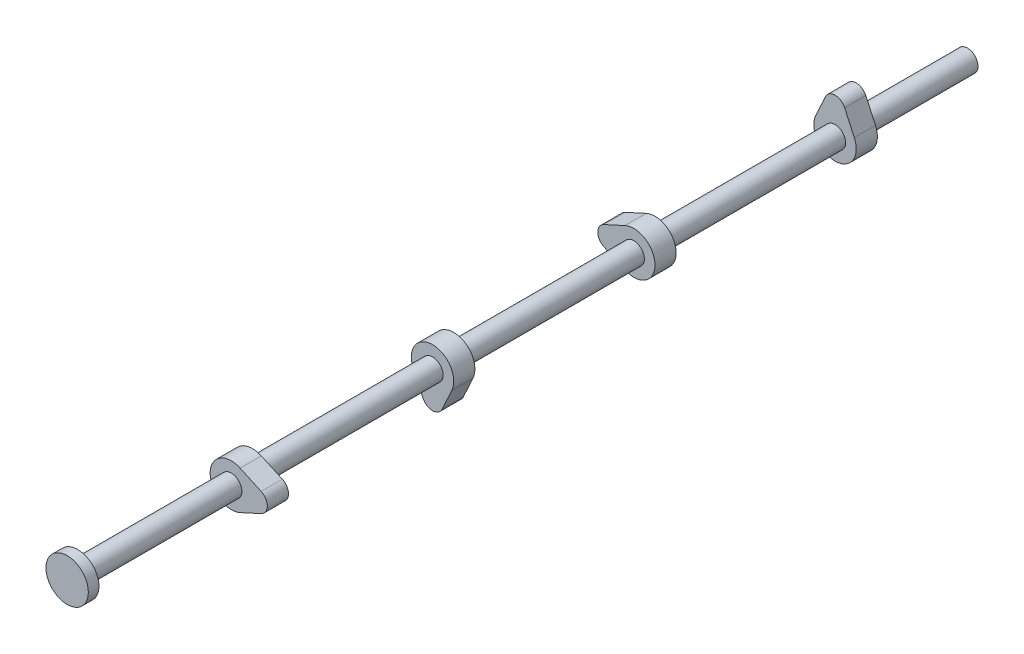
ISO-10303-21;
HEADER;
FILE_DESCRIPTION(('STEP AP214'),'2;1');
FILE_NAME('part.step','',(''),(''),'','','');
FILE_SCHEMA(('AUTOMOTIVE_DESIGN { 1 0 10303 214 1 1 1 1 }'));
ENDSEC;
DATA;
#1=APPLICATION_CONTEXT('core data for automotive mechanical design processes');
#2=APPLICATION_PROTOCOL_DEFINITION('international standard','automotive_design',2000,#1);
#3=PRODUCT_CONTEXT('',#1,'mechanical');
#4=PRODUCT('Part','Part','',(#3));
#5=PRODUCT_RELATED_PRODUCT_CATEGORY('part','',(#4));
#6=PRODUCT_DEFINITION_FORMATION('','',#4);
#7=PRODUCT_DEFINITION_CONTEXT('part definition',#1,'design');
#8=PRODUCT_DEFINITION('design','',#6,#7);
#9=PRODUCT_DEFINITION_SHAPE('','',#8);
#10=(LENGTH_UNIT() NAMED_UNIT(*) SI_UNIT(.MILLI.,.METRE.));
#11=(NAMED_UNIT(*) PLANE_ANGLE_UNIT() SI_UNIT($,.RADIAN.));
#12=(NAMED_UNIT(*) SI_UNIT($,.STERADIAN.) SOLID_ANGLE_UNIT());
#13=UNCERTAINTY_MEASURE_WITH_UNIT(LENGTH_MEASURE(1.E-05),#10,'distance_accuracy_value','');
#14=(GEOMETRIC_REPRESENTATION_CONTEXT(3) GLOBAL_UNCERTAINTY_ASSIGNED_CONTEXT((#13)) GLOBAL_UNIT_ASSIGNED_CONTEXT((#10,
#11,#12)) REPRESENTATION_CONTEXT('',''));
#15=CARTESIAN_POINT('',(0.,0.,0.));
#16=DIRECTION('',(0.,0.,1.));
#17=DIRECTION('',(1.,0.,0.));
#18=AXIS2_PLACEMENT_3D('',#15,#16,#17);
#19=CARTESIAN_POINT('',(0.,0.,2413.));
#20=DIRECTION('',(0.,0.,-1.));
#21=DIRECTION('',(0.,-1.,0.));
#22=AXIS2_PLACEMENT_3D('',#19,#20,#21);
#23=CYLINDRICAL_SURFACE('',#22,127.);
#24=CARTESIAN_POINT('',(0.,0.,1333.5));
#25=DIRECTION('',(0.,0.,1.));
#26=DIRECTION('',(0.,1.,0.));
#27=AXIS2_PLACEMENT_3D('',#24,#25,#26);
#28=CIRCLE('',#27,127.);
#29=CARTESIAN_POINT('',(1.33025439009923E-12,127.,1333.5));
#30=VERTEX_POINT('',#29);
#31=EDGE_CURVE('E55',#30,#30,#28,.T.);
#32=ORIENTED_EDGE('',*,*,#31,.T.);
#33=EDGE_LOOP('',(#32));
#34=FACE_BOUND('',#33,.T.);
#35=CARTESIAN_POINT('',(0.,0.,3492.5));
#36=DIRECTION('',(0.,0.,1.));
#37=DIRECTION('',(-1.,0.,0.));
#38=AXIS2_PLACEMENT_3D('',#35,#36,#37);
#39=CIRCLE('',#38,127.);
#40=CARTESIAN_POINT('',(-127.,8.86836260066156E-13,3492.5));
#41=VERTEX_POINT('',#40);
#42=EDGE_CURVE('E206',#41,#41,#39,.T.);
#43=ORIENTED_EDGE('',*,*,#42,.F.);
#44=EDGE_LOOP('',(#43));
#45=FACE_BOUND('',#44,.T.);
#46=ADVANCED_FACE('F47',(#34,#45),#23,.T.);
#47=CARTESIAN_POINT('',(0.,0.,1333.5));
#48=DIRECTION('',(0.,0.,-1.));
#49=DIRECTION('',(0.,-1.,0.));
#50=AXIS2_PLACEMENT_3D('',#47,#48,#49);
#51=CYLINDRICAL_SURFACE('',#50,254.);
#52=CARTESIAN_POINT('',(0.,0.,1079.5));
#53=DIRECTION('',(0.,0.,1.));
#54=DIRECTION('',(0.,1.,0.));
#55=AXIS2_PLACEMENT_3D('',#52,#53,#54);
#56=CIRCLE('',#55,254.);
#57=CARTESIAN_POINT('',(-230.901073093122,105.833333333336,1079.5));
#58=VERTEX_POINT('',#57);
#59=CARTESIAN_POINT('',(230.901073093124,105.833333333331,1079.5));
#60=VERTEX_POINT('',#59);
#61=EDGE_CURVE('E315',#58,#60,#56,.T.);
#62=ORIENTED_EDGE('',*,*,#61,.T.);
#63=DIRECTION('',(0.,0.,-1.));
#64=VECTOR('',#63,1.);
#65=CARTESIAN_POINT('',(230.901073093124,105.833333333331,1333.5));
#66=LINE('',#65,#64);
#67=CARTESIAN_POINT('',(230.901073093124,105.833333333331,1333.5));
#68=VERTEX_POINT('',#67);
#69=EDGE_CURVE('E343',#68,#60,#66,.T.);
#70=ORIENTED_EDGE('',*,*,#69,.F.);
#71=CARTESIAN_POINT('',(0.,0.,1333.5));
#72=DIRECTION('',(0.,0.,1.));
#73=DIRECTION('',(0.,1.,0.));
#74=AXIS2_PLACEMENT_3D('',#71,#72,#73);
#75=CIRCLE('',#74,254.);
#76=CARTESIAN_POINT('',(-230.901073093122,105.833333333336,1333.5));
#77=VERTEX_POINT('',#76);
#78=EDGE_CURVE('E316',#77,#68,#75,.T.);
#79=ORIENTED_EDGE('',*,*,#78,.F.);
#80=DIRECTION('',(0.,0.,-1.));
#81=VECTOR('',#80,1.);
#82=CARTESIAN_POINT('',(-230.901073093122,105.833333333336,1333.5));
#83=LINE('',#82,#81);
#84=EDGE_CURVE('E326',#77,#58,#83,.T.);
#85=ORIENTED_EDGE('',*,*,#84,.T.);
#86=EDGE_LOOP('',(#62,#70,#79,#85));
#87=FACE_BOUND('',#86,.T.);
#88=ADVANCED_FACE('F363',(#87),#51,.T.);
#89=CARTESIAN_POINT('',(230.901073093124,105.833333333331,1333.5));
#90=DIRECTION('',(-0.909059342886314,-0.416666666666657,0.));
#91=DIRECTION('',(0.416666666666657,-0.909059342886314,0.));
#92=AXIS2_PLACEMENT_3D('',#89,#90,#91);
#93=PLANE('',#92);
#94=DIRECTION('',(-0.416666666666657,0.909059342886314,0.));
#95=VECTOR('',#94,1.);
#96=CARTESIAN_POINT('',(230.901073093124,105.833333333331,1079.5));
#97=LINE('',#96,#95);
#98=CARTESIAN_POINT('',(115.450536546565,357.716666666665,1079.5));
#99=VERTEX_POINT('',#98);
#100=EDGE_CURVE('E329',#60,#99,#97,.T.);
#101=ORIENTED_EDGE('',*,*,#100,.T.);
#102=DIRECTION('',(0.,0.,-1.));
#103=VECTOR('',#102,1.);
#104=CARTESIAN_POINT('',(115.450536546565,357.716666666665,1333.5));
#105=LINE('',#104,#103);
#106=CARTESIAN_POINT('',(115.450536546565,357.716666666665,1333.5));
#107=VERTEX_POINT('',#106);
#108=EDGE_CURVE('E344',#107,#99,#105,.T.);
#109=ORIENTED_EDGE('',*,*,#108,.F.);
#110=DIRECTION('',(-0.416666666666657,0.909059342886314,0.));
#111=VECTOR('',#110,1.);
#112=CARTESIAN_POINT('',(230.901073093124,105.833333333331,1333.5));
#113=LINE('',#112,#111);
#114=EDGE_CURVE('E98',#68,#107,#113,.T.);
#115=ORIENTED_EDGE('',*,*,#114,.F.);
#116=ORIENTED_EDGE('',*,*,#69,.T.);
#117=EDGE_LOOP('',(#101,#109,#115,#116));
#118=FACE_BOUND('',#117,.T.);
#119=ADVANCED_FACE('F365',(#118),#93,.F.);
#120=CARTESIAN_POINT('',(3.15444661976667E-12,304.8,1333.5));
#121=DIRECTION('',(0.,0.,-1.));
#122=DIRECTION('',(0.,-1.,0.));
#123=AXIS2_PLACEMENT_3D('',#120,#121,#122);
#124=CYLINDRICAL_SURFACE('',#123,127.);
#125=CARTESIAN_POINT('',(3.15444661976667E-12,304.8,1079.5));
#126=DIRECTION('',(0.,0.,1.));
#127=DIRECTION('',(0.,1.,0.));
#128=AXIS2_PLACEMENT_3D('',#125,#126,#127);
#129=CIRCLE('',#128,127.);
#130=CARTESIAN_POINT('',(-115.450536546558,357.716666666668,1079.5));
#131=VERTEX_POINT('',#130);
#132=EDGE_CURVE('E81',#99,#131,#129,.T.);
#133=ORIENTED_EDGE('',*,*,#132,.T.);
#134=DIRECTION('',(0.,0.,-1.));
#135=VECTOR('',#134,1.);
#136=CARTESIAN_POINT('',(-115.450536546558,357.716666666668,1333.5));
#137=LINE('',#136,#135);
#138=CARTESIAN_POINT('',(-115.450536546558,357.716666666668,1333.5));
#139=VERTEX_POINT('',#138);
#140=EDGE_CURVE('E338',#139,#131,#137,.T.);
#141=ORIENTED_EDGE('',*,*,#140,.F.);
#142=CARTESIAN_POINT('',(3.15444661976667E-12,304.8,1333.5));
#143=DIRECTION('',(0.,0.,1.));
#144=DIRECTION('',(0.,1.,0.));
#145=AXIS2_PLACEMENT_3D('',#142,#143,#144);
#146=CIRCLE('',#145,127.);
#147=EDGE_CURVE('E321',#107,#139,#146,.T.);
#148=ORIENTED_EDGE('',*,*,#147,.F.);
#149=ORIENTED_EDGE('',*,*,#108,.T.);
#150=EDGE_LOOP('',(#133,#141,#148,#149));
#151=FACE_BOUND('',#150,.T.);
#152=ADVANCED_FACE('F368',(#151),#124,.T.);
#153=CARTESIAN_POINT('',(-230.901073093122,105.833333333336,1333.5));
#154=DIRECTION('',(0.909059342886305,-0.416666666666676,0.));
#155=DIRECTION('',(0.416666666666676,0.909059342886305,0.));
#156=AXIS2_PLACEMENT_3D('',#153,#154,#155);
#157=PLANE('',#156);
#158=DIRECTION('',(-0.416666666666676,-0.909059342886305,0.));
#159=VECTOR('',#158,1.);
#160=CARTESIAN_POINT('',(-230.901073093122,105.833333333336,1079.5));
#161=LINE('',#160,#159);
#162=EDGE_CURVE('E89',#131,#58,#161,.T.);
#163=ORIENTED_EDGE('',*,*,#162,.T.);
#164=ORIENTED_EDGE('',*,*,#84,.F.);
#165=DIRECTION('',(-0.416666666666676,-0.909059342886305,0.));
#166=VECTOR('',#165,1.);
#167=CARTESIAN_POINT('',(-230.901073093122,105.833333333336,1333.5));
#168=LINE('',#167,#166);
#169=EDGE_CURVE('E67',#139,#77,#168,.T.);
#170=ORIENTED_EDGE('',*,*,#169,.F.);
#171=ORIENTED_EDGE('',*,*,#140,.T.);
#172=EDGE_LOOP('',(#163,#164,#170,#171));
#173=FACE_BOUND('',#172,.T.);
#174=ADVANCED_FACE('F359',(#173),#157,.F.);
#175=CARTESIAN_POINT('',(0.,0.,1333.5));
#176=DIRECTION('',(0.,0.,1.));
#177=DIRECTION('',(0.,1.,0.));
#178=AXIS2_PLACEMENT_3D('',#175,#176,#177);
#179=PLANE('',#178);
#180=ORIENTED_EDGE('',*,*,#31,.F.);
#181=EDGE_LOOP('',(#180));
#182=FACE_BOUND('',#181,.T.);
#183=ORIENTED_EDGE('',*,*,#78,.T.);
#184=ORIENTED_EDGE('',*,*,#114,.T.);
#185=ORIENTED_EDGE('',*,*,#147,.T.);
#186=ORIENTED_EDGE('',*,*,#169,.T.);
#187=EDGE_LOOP('',(#183,#184,#185,#186));
#188=FACE_BOUND('',#187,.T.);
#189=ADVANCED_FACE('F353',(#182,#188),#179,.T.);
#190=CARTESIAN_POINT('',(0.,0.,1079.5));
#191=DIRECTION('',(0.,0.,1.));
#192=DIRECTION('',(0.,1.,0.));
#193=AXIS2_PLACEMENT_3D('',#190,#191,#192);
#194=PLANE('',#193);
#195=CARTESIAN_POINT('',(0.,0.,1079.5));
#196=DIRECTION('',(0.,0.,1.));
#197=DIRECTION('',(0.,1.,0.));
#198=AXIS2_PLACEMENT_3D('',#195,#196,#197);
#199=CIRCLE('',#198,127.);
#200=CARTESIAN_POINT('',(1.33025439009923E-12,127.,1079.5));
#201=VERTEX_POINT('',#200);
#202=EDGE_CURVE('E11',#201,#201,#199,.T.);
#203=ORIENTED_EDGE('',*,*,#202,.T.);
#204=EDGE_LOOP('',(#203));
#205=FACE_BOUND('',#204,.T.);
#206=ORIENTED_EDGE('',*,*,#61,.F.);
#207=ORIENTED_EDGE('',*,*,#162,.F.);
#208=ORIENTED_EDGE('',*,*,#132,.F.);
#209=ORIENTED_EDGE('',*,*,#100,.F.);
#210=EDGE_LOOP('',(#206,#207,#208,#209));
#211=FACE_BOUND('',#210,.T.);
#212=ADVANCED_FACE('F357',(#205,#211),#194,.F.);
#213=ORIENTED_EDGE('',*,*,#202,.F.);
#214=EDGE_LOOP('',(#213));
#215=FACE_BOUND('',#214,.T.);
#216=CARTESIAN_POINT('',(0.,0.,-254.));
#217=DIRECTION('',(0.,0.,-1.));
#218=DIRECTION('',(-1.,0.,0.));
#219=AXIS2_PLACEMENT_3D('',#216,#217,#218);
#220=CIRCLE('',#219,127.);
#221=CARTESIAN_POINT('',(-127.,0.,-254.));
#222=VERTEX_POINT('',#221);
#223=EDGE_CURVE('E396',#222,#222,#220,.T.);
#224=ORIENTED_EDGE('',*,*,#223,.F.);
#225=EDGE_LOOP('',(#224));
#226=FACE_BOUND('',#225,.T.);
#227=ADVANCED_FACE('F378',(#215,#226),#23,.T.);
#228=CARTESIAN_POINT('',(0.,0.,9652.));
#229=DIRECTION('',(0.,0.,-1.));
#230=DIRECTION('',(-1.,0.,0.));
#231=AXIS2_PLACEMENT_3D('',#228,#229,#230);
#232=CYLINDRICAL_SURFACE('',#231,127.);
#233=CARTESIAN_POINT('',(0.,0.,8572.5));
#234=DIRECTION('',(0.,0.,1.));
#235=DIRECTION('',(1.,0.,0.));
#236=AXIS2_PLACEMENT_3D('',#233,#234,#235);
#237=CIRCLE('',#236,127.);
#238=CARTESIAN_POINT('',(127.,0.,8572.5));
#239=VERTEX_POINT('',#238);
#240=EDGE_CURVE('E307',#239,#239,#237,.T.);
#241=ORIENTED_EDGE('',*,*,#240,.T.);
#242=EDGE_LOOP('',(#241));
#243=FACE_BOUND('',#242,.T.);
#244=CARTESIAN_POINT('',(0.,0.,10414.));
#245=DIRECTION('',(0.,0.,1.));
#246=DIRECTION('',(1.,0.,0.));
#247=AXIS2_PLACEMENT_3D('',#244,#245,#246);
#248=CIRCLE('',#247,127.);
#249=CARTESIAN_POINT('',(127.,0.,10414.));
#250=VERTEX_POINT('',#249);
#251=EDGE_CURVE('E405',#250,#250,#248,.T.);
#252=ORIENTED_EDGE('',*,*,#251,.F.);
#253=EDGE_LOOP('',(#252));
#254=FACE_BOUND('',#253,.T.);
#255=ADVANCED_FACE('F382',(#243,#254),#232,.T.);
#256=CARTESIAN_POINT('',(0.,0.,8572.5));
#257=DIRECTION('',(0.,0.,-1.));
#258=DIRECTION('',(-1.,0.,0.));
#259=AXIS2_PLACEMENT_3D('',#256,#257,#258);
#260=CYLINDRICAL_SURFACE('',#259,254.);
#261=CARTESIAN_POINT('',(0.,0.,8318.5));
#262=DIRECTION('',(0.,0.,1.));
#263=DIRECTION('',(1.,0.,0.));
#264=AXIS2_PLACEMENT_3D('',#261,#262,#263);
#265=CIRCLE('',#264,254.);
#266=CARTESIAN_POINT('',(105.833333333333,230.901073093123,8318.5));
#267=VERTEX_POINT('',#266);
#268=CARTESIAN_POINT('',(105.833333333333,-230.901073093123,8318.5));
#269=VERTEX_POINT('',#268);
#270=EDGE_CURVE('E265',#267,#269,#265,.T.);
#271=ORIENTED_EDGE('',*,*,#270,.T.);
#272=DIRECTION('',(0.,0.,-1.));
#273=VECTOR('',#272,1.);
#274=CARTESIAN_POINT('',(105.833333333333,-230.901073093123,8572.5));
#275=LINE('',#274,#273);
#276=CARTESIAN_POINT('',(105.833333333333,-230.901073093123,8572.5));
#277=VERTEX_POINT('',#276);
#278=EDGE_CURVE('E305',#277,#269,#275,.T.);
#279=ORIENTED_EDGE('',*,*,#278,.F.);
#280=CARTESIAN_POINT('',(0.,0.,8572.5));
#281=DIRECTION('',(0.,0.,1.));
#282=DIRECTION('',(1.,0.,0.));
#283=AXIS2_PLACEMENT_3D('',#280,#281,#282);
#284=CIRCLE('',#283,254.);
#285=CARTESIAN_POINT('',(105.833333333333,230.901073093123,8572.5));
#286=VERTEX_POINT('',#285);
#287=EDGE_CURVE('E266',#286,#277,#284,.T.);
#288=ORIENTED_EDGE('',*,*,#287,.F.);
#289=DIRECTION('',(0.,0.,-1.));
#290=VECTOR('',#289,1.);
#291=CARTESIAN_POINT('',(105.833333333333,230.901073093123,8572.5));
#292=LINE('',#291,#290);
#293=EDGE_CURVE('E278',#286,#267,#292,.T.);
#294=ORIENTED_EDGE('',*,*,#293,.T.);
#295=EDGE_LOOP('',(#271,#279,#288,#294));
#296=FACE_BOUND('',#295,.T.);
#297=ADVANCED_FACE('F388',(#296),#260,.T.);
#298=CARTESIAN_POINT('',(105.833333333333,-230.901073093123,8572.5));
#299=DIRECTION('',(-0.416666666666667,0.909059342886309,0.));
#300=DIRECTION('',(-0.90905934288631,-0.416666666666667,0.));
#301=AXIS2_PLACEMENT_3D('',#298,#299,#300);
#302=PLANE('',#301);
#303=DIRECTION('',(0.909059342886309,0.416666666666667,0.));
#304=VECTOR('',#303,1.);
#305=CARTESIAN_POINT('',(105.833333333333,-230.901073093123,8318.5));
#306=LINE('',#305,#304);
#307=CARTESIAN_POINT('',(357.716666666667,-115.450536546561,8318.5));
#308=VERTEX_POINT('',#307);
#309=EDGE_CURVE('E283',#269,#308,#306,.T.);
#310=ORIENTED_EDGE('',*,*,#309,.T.);
#311=DIRECTION('',(0.,0.,-1.));
#312=VECTOR('',#311,1.);
#313=CARTESIAN_POINT('',(357.716666666667,-115.450536546561,8572.5));
#314=LINE('',#313,#312);
#315=CARTESIAN_POINT('',(357.716666666667,-115.450536546561,8572.5));
#316=VERTEX_POINT('',#315);
#317=EDGE_CURVE('E298',#316,#308,#314,.T.);
#318=ORIENTED_EDGE('',*,*,#317,.F.);
#319=DIRECTION('',(0.909059342886309,0.416666666666667,0.));
#320=VECTOR('',#319,1.);
#321=CARTESIAN_POINT('',(105.833333333333,-230.901073093123,8572.5));
#322=LINE('',#321,#320);
#323=EDGE_CURVE('E269',#277,#316,#322,.T.);
#324=ORIENTED_EDGE('',*,*,#323,.F.);
#325=ORIENTED_EDGE('',*,*,#278,.T.);
#326=EDGE_LOOP('',(#310,#318,#324,#325));
#327=FACE_BOUND('',#326,.T.);
#328=ADVANCED_FACE('F491',(#327),#302,.F.);
#329=CARTESIAN_POINT('',(304.8,0.,8572.5));
#330=DIRECTION('',(0.,0.,-1.));
#331=DIRECTION('',(-1.,0.,0.));
#332=AXIS2_PLACEMENT_3D('',#329,#330,#331);
#333=CYLINDRICAL_SURFACE('',#332,127.);
#334=CARTESIAN_POINT('',(304.8,0.,8318.5));
#335=DIRECTION('',(0.,0.,1.));
#336=DIRECTION('',(1.,0.,0.));
#337=AXIS2_PLACEMENT_3D('',#334,#335,#336);
#338=CIRCLE('',#337,127.);
#339=CARTESIAN_POINT('',(357.716666666667,115.450536546561,8318.5));
#340=VERTEX_POINT('',#339);
#341=EDGE_CURVE('E289',#308,#340,#338,.T.);
#342=ORIENTED_EDGE('',*,*,#341,.T.);
#343=DIRECTION('',(0.,0.,-1.));
#344=VECTOR('',#343,1.);
#345=CARTESIAN_POINT('',(357.716666666667,115.450536546561,8572.5));
#346=LINE('',#345,#344);
#347=CARTESIAN_POINT('',(357.716666666667,115.450536546561,8572.5));
#348=VERTEX_POINT('',#347);
#349=EDGE_CURVE('E293',#348,#340,#346,.T.);
#350=ORIENTED_EDGE('',*,*,#349,.F.);
#351=CARTESIAN_POINT('',(304.8,0.,8572.5));
#352=DIRECTION('',(0.,0.,1.));
#353=DIRECTION('',(1.,0.,0.));
#354=AXIS2_PLACEMENT_3D('',#351,#352,#353);
#355=CIRCLE('',#354,127.);
#356=EDGE_CURVE('E273',#316,#348,#355,.T.);
#357=ORIENTED_EDGE('',*,*,#356,.F.);
#358=ORIENTED_EDGE('',*,*,#317,.T.);
#359=EDGE_LOOP('',(#342,#350,#357,#358));
#360=FACE_BOUND('',#359,.T.);
#361=ADVANCED_FACE('F490',(#360),#333,.T.);
#362=CARTESIAN_POINT('',(105.833333333333,230.901073093123,8572.5));
#363=DIRECTION('',(-0.416666666666667,-0.90905934288631,0.));
#364=DIRECTION('',(0.90905934288631,-0.416666666666667,0.));
#365=AXIS2_PLACEMENT_3D('',#362,#363,#364);
#366=PLANE('',#365);
#367=DIRECTION('',(-0.909059342886309,0.416666666666667,0.));
#368=VECTOR('',#367,1.);
#369=CARTESIAN_POINT('',(105.833333333333,230.901073093123,8318.5));
#370=LINE('',#369,#368);
#371=EDGE_CURVE('E271',#340,#267,#370,.T.);
#372=ORIENTED_EDGE('',*,*,#371,.T.);
#373=ORIENTED_EDGE('',*,*,#293,.F.);
#374=DIRECTION('',(-0.909059342886309,0.416666666666667,0.));
#375=VECTOR('',#374,1.);
#376=CARTESIAN_POINT('',(105.833333333333,230.901073093123,8572.5));
#377=LINE('',#376,#375);
#378=EDGE_CURVE('E280',#348,#286,#377,.T.);
#379=ORIENTED_EDGE('',*,*,#378,.F.);
#380=ORIENTED_EDGE('',*,*,#349,.T.);
#381=EDGE_LOOP('',(#372,#373,#379,#380));
#382=FACE_BOUND('',#381,.T.);
#383=ADVANCED_FACE('F477',(#382),#366,.F.);
#384=CARTESIAN_POINT('',(0.,0.,8572.5));
#385=DIRECTION('',(0.,0.,1.));
#386=DIRECTION('',(1.,0.,0.));
#387=AXIS2_PLACEMENT_3D('',#384,#385,#386);
#388=PLANE('',#387);
#389=ORIENTED_EDGE('',*,*,#240,.F.);
#390=EDGE_LOOP('',(#389));
#391=FACE_BOUND('',#390,.T.);
#392=ORIENTED_EDGE('',*,*,#287,.T.);
#393=ORIENTED_EDGE('',*,*,#323,.T.);
#394=ORIENTED_EDGE('',*,*,#356,.T.);
#395=ORIENTED_EDGE('',*,*,#378,.T.);
#396=EDGE_LOOP('',(#392,#393,#394,#395));
#397=FACE_BOUND('',#396,.T.);
#398=ADVANCED_FACE('F478',(#391,#397),#388,.T.);
#399=CARTESIAN_POINT('',(0.,0.,8318.5));
#400=DIRECTION('',(0.,0.,1.));
#401=DIRECTION('',(1.,0.,0.));
#402=AXIS2_PLACEMENT_3D('',#399,#400,#401);
#403=PLANE('',#402);
#404=CARTESIAN_POINT('',(0.,0.,8318.5));
#405=DIRECTION('',(0.,0.,1.));
#406=DIRECTION('',(1.,0.,0.));
#407=AXIS2_PLACEMENT_3D('',#404,#405,#406);
#408=CIRCLE('',#407,127.);
#409=CARTESIAN_POINT('',(127.,0.,8318.5));
#410=VERTEX_POINT('',#409);
#411=EDGE_CURVE('E306',#410,#410,#408,.T.);
#412=ORIENTED_EDGE('',*,*,#411,.T.);
#413=EDGE_LOOP('',(#412));
#414=FACE_BOUND('',#413,.T.);
#415=ORIENTED_EDGE('',*,*,#270,.F.);
#416=ORIENTED_EDGE('',*,*,#371,.F.);
#417=ORIENTED_EDGE('',*,*,#341,.F.);
#418=ORIENTED_EDGE('',*,*,#309,.F.);
#419=EDGE_LOOP('',(#415,#416,#417,#418));
#420=FACE_BOUND('',#419,.T.);
#421=ADVANCED_FACE('F479',(#414,#420),#403,.F.);
#422=ORIENTED_EDGE('',*,*,#411,.F.);
#423=EDGE_LOOP('',(#422));
#424=FACE_BOUND('',#423,.T.);
#425=CARTESIAN_POINT('',(0.,0.,6159.5));
#426=DIRECTION('',(0.,0.,1.));
#427=DIRECTION('',(0.,-1.,0.));
#428=AXIS2_PLACEMENT_3D('',#425,#426,#427);
#429=CIRCLE('',#428,127.);
#430=CARTESIAN_POINT('',(-4.43418130033078E-13,-127.,6159.5));
#431=VERTEX_POINT('',#430);
#432=EDGE_CURVE('E260',#431,#431,#429,.T.);
#433=ORIENTED_EDGE('',*,*,#432,.T.);
#434=EDGE_LOOP('',(#433));
#435=FACE_BOUND('',#434,.T.);
#436=ADVANCED_FACE('F392',(#424,#435),#232,.T.);
#437=CARTESIAN_POINT('',(0.,0.,6159.5));
#438=DIRECTION('',(0.,0.,-1.));
#439=DIRECTION('',(0.,1.,0.));
#440=AXIS2_PLACEMENT_3D('',#437,#438,#439);
#441=CYLINDRICAL_SURFACE('',#440,254.);
#442=CARTESIAN_POINT('',(0.,0.,5905.5));
#443=DIRECTION('',(0.,0.,1.));
#444=DIRECTION('',(0.,-1.,0.));
#445=AXIS2_PLACEMENT_3D('',#442,#443,#444);
#446=CIRCLE('',#445,254.);
#447=CARTESIAN_POINT('',(230.901073093122,-105.833333333334,5905.5));
#448=VERTEX_POINT('',#447);
#449=CARTESIAN_POINT('',(-230.901073093123,-105.833333333333,5905.5));
#450=VERTEX_POINT('',#449);
#451=EDGE_CURVE('E212',#448,#450,#446,.T.);
#452=ORIENTED_EDGE('',*,*,#451,.T.);
#453=DIRECTION('',(0.,0.,-1.));
#454=VECTOR('',#453,1.);
#455=CARTESIAN_POINT('',(-230.901073093123,-105.833333333333,6159.5));
#456=LINE('',#455,#454);
#457=CARTESIAN_POINT('',(-230.901073093123,-105.833333333333,6159.5));
#458=VERTEX_POINT('',#457);
#459=EDGE_CURVE('E251',#458,#450,#456,.T.);
#460=ORIENTED_EDGE('',*,*,#459,.F.);
#461=CARTESIAN_POINT('',(0.,0.,6159.5));
#462=DIRECTION('',(0.,0.,1.));
#463=DIRECTION('',(0.,-1.,0.));
#464=AXIS2_PLACEMENT_3D('',#461,#462,#463);
#465=CIRCLE('',#464,254.);
#466=CARTESIAN_POINT('',(230.901073093122,-105.833333333334,6159.5));
#467=VERTEX_POINT('',#466);
#468=EDGE_CURVE('E216',#467,#458,#465,.T.);
#469=ORIENTED_EDGE('',*,*,#468,.F.);
#470=DIRECTION('',(0.,0.,-1.));
#471=VECTOR('',#470,1.);
#472=CARTESIAN_POINT('',(230.901073093122,-105.833333333334,6159.5));
#473=LINE('',#472,#471);
#474=EDGE_CURVE('E229',#467,#448,#473,.T.);
#475=ORIENTED_EDGE('',*,*,#474,.T.);
#476=EDGE_LOOP('',(#452,#460,#469,#475));
#477=FACE_BOUND('',#476,.T.);
#478=ADVANCED_FACE('F470',(#477),#441,.T.);
#479=CARTESIAN_POINT('',(-230.901073093123,-105.833333333333,6159.5));
#480=DIRECTION('',(0.909059342886311,0.416666666666664,0.));
#481=DIRECTION('',(-0.416666666666664,0.909059342886311,0.));
#482=AXIS2_PLACEMENT_3D('',#479,#480,#481);
#483=PLANE('',#482);
#484=DIRECTION('',(0.416666666666664,-0.909059342886311,0.));
#485=VECTOR('',#484,1.);
#486=CARTESIAN_POINT('',(-230.901073093123,-105.833333333333,5905.5));
#487=LINE('',#486,#485);
#488=CARTESIAN_POINT('',(-115.450536546563,-357.716666666666,5905.5));
#489=VERTEX_POINT('',#488);
#490=EDGE_CURVE('E231',#450,#489,#487,.T.);
#491=ORIENTED_EDGE('',*,*,#490,.T.);
#492=DIRECTION('',(0.,0.,-1.));
#493=VECTOR('',#492,1.);
#494=CARTESIAN_POINT('',(-115.450536546563,-357.716666666666,6159.5));
#495=LINE('',#494,#493);
#496=CARTESIAN_POINT('',(-115.450536546563,-357.716666666666,6159.5));
#497=VERTEX_POINT('',#496);
#498=EDGE_CURVE('E246',#497,#489,#495,.T.);
#499=ORIENTED_EDGE('',*,*,#498,.F.);
#500=DIRECTION('',(0.416666666666664,-0.909059342886311,0.));
#501=VECTOR('',#500,1.);
#502=CARTESIAN_POINT('',(-230.901073093123,-105.833333333333,6159.5));
#503=LINE('',#502,#501);
#504=EDGE_CURVE('E219',#458,#497,#503,.T.);
#505=ORIENTED_EDGE('',*,*,#504,.F.);
#506=ORIENTED_EDGE('',*,*,#459,.T.);
#507=EDGE_LOOP('',(#491,#499,#505,#506));
#508=FACE_BOUND('',#507,.T.);
#509=ADVANCED_FACE('F463',(#508),#483,.F.);
#510=CARTESIAN_POINT('',(-1.0260395956079E-12,-304.8,6159.5));
#511=DIRECTION('',(0.,0.,-1.));
#512=DIRECTION('',(0.,1.,0.));
#513=AXIS2_PLACEMENT_3D('',#510,#511,#512);
#514=CYLINDRICAL_SURFACE('',#513,127.);
#515=CARTESIAN_POINT('',(-1.0260395956079E-12,-304.8,5905.5));
#516=DIRECTION('',(0.,0.,1.));
#517=DIRECTION('',(0.,-1.,0.));
#518=AXIS2_PLACEMENT_3D('',#515,#516,#517);
#519=CIRCLE('',#518,127.);
#520=CARTESIAN_POINT('',(115.45053654656,-357.716666666667,5905.5));
#521=VERTEX_POINT('',#520);
#522=EDGE_CURVE('E240',#489,#521,#519,.T.);
#523=ORIENTED_EDGE('',*,*,#522,.T.);
#524=DIRECTION('',(0.,0.,-1.));
#525=VECTOR('',#524,1.);
#526=CARTESIAN_POINT('',(115.45053654656,-357.716666666667,6159.5));
#527=LINE('',#526,#525);
#528=CARTESIAN_POINT('',(115.45053654656,-357.716666666667,6159.5));
#529=VERTEX_POINT('',#528);
#530=EDGE_CURVE('E244',#529,#521,#527,.T.);
#531=ORIENTED_EDGE('',*,*,#530,.F.);
#532=CARTESIAN_POINT('',(-1.0260395956079E-12,-304.8,6159.5));
#533=DIRECTION('',(0.,0.,1.));
#534=DIRECTION('',(0.,-1.,0.));
#535=AXIS2_PLACEMENT_3D('',#532,#533,#534);
#536=CIRCLE('',#535,127.);
#537=EDGE_CURVE('E221',#497,#529,#536,.T.);
#538=ORIENTED_EDGE('',*,*,#537,.F.);
#539=ORIENTED_EDGE('',*,*,#498,.T.);
#540=EDGE_LOOP('',(#523,#531,#538,#539));
#541=FACE_BOUND('',#540,.T.);
#542=ADVANCED_FACE('F458',(#541),#514,.T.);
#543=CARTESIAN_POINT('',(230.901073093122,-105.833333333334,6159.5));
#544=DIRECTION('',(-0.909059342886308,0.41666666666667,0.));
#545=DIRECTION('',(-0.41666666666667,-0.909059342886308,0.));
#546=AXIS2_PLACEMENT_3D('',#543,#544,#545);
#547=PLANE('',#546);
#548=DIRECTION('',(0.41666666666667,0.909059342886308,0.));
#549=VECTOR('',#548,1.);
#550=CARTESIAN_POINT('',(230.901073093122,-105.833333333334,5905.5));
#551=LINE('',#550,#549);
#552=EDGE_CURVE('E222',#521,#448,#551,.T.);
#553=ORIENTED_EDGE('',*,*,#552,.T.);
#554=ORIENTED_EDGE('',*,*,#474,.F.);
#555=DIRECTION('',(0.41666666666667,0.909059342886308,0.));
#556=VECTOR('',#555,1.);
#557=CARTESIAN_POINT('',(230.901073093122,-105.833333333334,6159.5));
#558=LINE('',#557,#556);
#559=EDGE_CURVE('E230',#529,#467,#558,.T.);
#560=ORIENTED_EDGE('',*,*,#559,.F.);
#561=ORIENTED_EDGE('',*,*,#530,.T.);
#562=EDGE_LOOP('',(#553,#554,#560,#561));
#563=FACE_BOUND('',#562,.T.);
#564=ADVANCED_FACE('F455',(#563),#547,.F.);
#565=CARTESIAN_POINT('',(0.,0.,6159.5));
#566=DIRECTION('',(0.,0.,1.));
#567=DIRECTION('',(0.,-1.,0.));
#568=AXIS2_PLACEMENT_3D('',#565,#566,#567);
#569=PLANE('',#568);
#570=ORIENTED_EDGE('',*,*,#432,.F.);
#571=EDGE_LOOP('',(#570));
#572=FACE_BOUND('',#571,.T.);
#573=ORIENTED_EDGE('',*,*,#468,.T.);
#574=ORIENTED_EDGE('',*,*,#504,.T.);
#575=ORIENTED_EDGE('',*,*,#537,.T.);
#576=ORIENTED_EDGE('',*,*,#559,.T.);
#577=EDGE_LOOP('',(#573,#574,#575,#576));
#578=FACE_BOUND('',#577,.T.);
#579=ADVANCED_FACE('F448',(#572,#578),#569,.T.);
#580=CARTESIAN_POINT('',(0.,0.,5905.5));
#581=DIRECTION('',(0.,0.,1.));
#582=DIRECTION('',(0.,-1.,0.));
#583=AXIS2_PLACEMENT_3D('',#580,#581,#582);
#584=PLANE('',#583);
#585=CARTESIAN_POINT('',(0.,0.,5905.5));
#586=DIRECTION('',(0.,0.,1.));
#587=DIRECTION('',(0.,-1.,0.));
#588=AXIS2_PLACEMENT_3D('',#585,#586,#587);
#589=CIRCLE('',#588,127.);
#590=CARTESIAN_POINT('',(-4.43418130033078E-13,-127.,5905.5));
#591=VERTEX_POINT('',#590);
#592=EDGE_CURVE('E256',#591,#591,#589,.T.);
#593=ORIENTED_EDGE('',*,*,#592,.T.);
#594=EDGE_LOOP('',(#593));
#595=FACE_BOUND('',#594,.T.);
#596=ORIENTED_EDGE('',*,*,#451,.F.);
#597=ORIENTED_EDGE('',*,*,#552,.F.);
#598=ORIENTED_EDGE('',*,*,#522,.F.);
#599=ORIENTED_EDGE('',*,*,#490,.F.);
#600=EDGE_LOOP('',(#596,#597,#598,#599));
#601=FACE_BOUND('',#600,.T.);
#602=ADVANCED_FACE('F454',(#595,#601),#584,.F.);
#603=CARTESIAN_POINT('',(0.,0.,7239.));
#604=DIRECTION('',(0.,0.,-1.));
#605=DIRECTION('',(0.,1.,0.));
#606=AXIS2_PLACEMENT_3D('',#603,#604,#605);
#607=CYLINDRICAL_SURFACE('',#606,127.);
#608=ORIENTED_EDGE('',*,*,#592,.F.);
#609=EDGE_LOOP('',(#608));
#610=FACE_BOUND('',#609,.T.);
#611=CARTESIAN_POINT('',(0.,0.,3746.5));
#612=DIRECTION('',(0.,0.,1.));
#613=DIRECTION('',(-1.,0.,0.));
#614=AXIS2_PLACEMENT_3D('',#611,#612,#613);
#615=CIRCLE('',#614,127.);
#616=CARTESIAN_POINT('',(-127.,8.86836260066156E-13,3746.5));
#617=VERTEX_POINT('',#616);
#618=EDGE_CURVE('E203',#617,#617,#615,.T.);
#619=ORIENTED_EDGE('',*,*,#618,.T.);
#620=EDGE_LOOP('',(#619));
#621=FACE_BOUND('',#620,.T.);
#622=ADVANCED_FACE('F447',(#610,#621),#607,.T.);
#623=CARTESIAN_POINT('',(0.,0.,3746.5));
#624=DIRECTION('',(0.,0.,-1.));
#625=DIRECTION('',(1.,0.,0.));
#626=AXIS2_PLACEMENT_3D('',#623,#624,#625);
#627=CYLINDRICAL_SURFACE('',#626,254.);
#628=CARTESIAN_POINT('',(0.,0.,3492.5));
#629=DIRECTION('',(0.,0.,1.));
#630=DIRECTION('',(-1.,0.,0.));
#631=AXIS2_PLACEMENT_3D('',#628,#629,#630);
#632=CIRCLE('',#631,254.);
#633=CARTESIAN_POINT('',(-105.833333333335,-230.901073093122,3492.5));
#634=VERTEX_POINT('',#633);
#635=CARTESIAN_POINT('',(-105.833333333332,230.901073093123,3492.5));
#636=VERTEX_POINT('',#635);
#637=EDGE_CURVE('E200',#634,#636,#632,.T.);
#638=ORIENTED_EDGE('',*,*,#637,.T.);
#639=DIRECTION('',(0.,0.,-1.));
#640=VECTOR('',#639,1.);
#641=CARTESIAN_POINT('',(-105.833333333332,230.901073093123,3746.5));
#642=LINE('',#641,#640);
#643=CARTESIAN_POINT('',(-105.833333333332,230.901073093123,3746.5));
#644=VERTEX_POINT('',#643);
#645=EDGE_CURVE('E179',#644,#636,#642,.T.);
#646=ORIENTED_EDGE('',*,*,#645,.F.);
#647=CARTESIAN_POINT('',(0.,0.,3746.5));
#648=DIRECTION('',(0.,0.,1.));
#649=DIRECTION('',(-1.,0.,0.));
#650=AXIS2_PLACEMENT_3D('',#647,#648,#649);
#651=CIRCLE('',#650,254.);
#652=CARTESIAN_POINT('',(-105.833333333335,-230.901073093122,3746.5));
#653=VERTEX_POINT('',#652);
#654=EDGE_CURVE('E183',#653,#644,#651,.T.);
#655=ORIENTED_EDGE('',*,*,#654,.F.);
#656=DIRECTION('',(0.,0.,-1.));
#657=VECTOR('',#656,1.);
#658=CARTESIAN_POINT('',(-105.833333333335,-230.901073093122,3746.5));
#659=LINE('',#658,#657);
#660=EDGE_CURVE('E418',#653,#634,#659,.T.);
#661=ORIENTED_EDGE('',*,*,#660,.T.);
#662=EDGE_LOOP('',(#638,#646,#655,#661));
#663=FACE_BOUND('',#662,.T.);
#664=ADVANCED_FACE('F197',(#663),#627,.T.);
#665=CARTESIAN_POINT('',(-105.833333333332,230.901073093123,3746.5));
#666=DIRECTION('',(0.416666666666661,-0.909059342886312,0.));
#667=DIRECTION('',(0.909059342886313,0.416666666666661,0.));
#668=AXIS2_PLACEMENT_3D('',#665,#666,#667);
#669=PLANE('',#668);
#670=DIRECTION('',(-0.909059342886312,-0.416666666666661,0.));
#671=VECTOR('',#670,1.);
#672=CARTESIAN_POINT('',(-105.833333333332,230.901073093123,3492.5));
#673=LINE('',#672,#671);
#674=CARTESIAN_POINT('',(-357.716666666666,115.450536546564,3492.5));
#675=VERTEX_POINT('',#674);
#676=EDGE_CURVE('E406',#636,#675,#673,.T.);
#677=ORIENTED_EDGE('',*,*,#676,.T.);
#678=DIRECTION('',(0.,0.,-1.));
#679=VECTOR('',#678,1.);
#680=CARTESIAN_POINT('',(-357.716666666666,115.450536546564,3746.5));
#681=LINE('',#680,#679);
#682=CARTESIAN_POINT('',(-357.716666666666,115.450536546564,3746.5));
#683=VERTEX_POINT('',#682);
#684=EDGE_CURVE('E178',#683,#675,#681,.T.);
#685=ORIENTED_EDGE('',*,*,#684,.F.);
#686=DIRECTION('',(-0.909059342886312,-0.416666666666661,0.));
#687=VECTOR('',#686,1.);
#688=CARTESIAN_POINT('',(-105.833333333332,230.901073093123,3746.5));
#689=LINE('',#688,#687);
#690=EDGE_CURVE('E172',#644,#683,#689,.T.);
#691=ORIENTED_EDGE('',*,*,#690,.F.);
#692=ORIENTED_EDGE('',*,*,#645,.T.);
#693=EDGE_LOOP('',(#677,#685,#691,#692));
#694=FACE_BOUND('',#693,.T.);
#695=ADVANCED_FACE('F174',(#694),#669,.F.);
#696=CARTESIAN_POINT('',(-304.8,2.09024310768728E-12,3746.5));
#697=DIRECTION('',(0.,0.,-1.));
#698=DIRECTION('',(1.,0.,0.));
#699=AXIS2_PLACEMENT_3D('',#696,#697,#698);
#700=CYLINDRICAL_SURFACE('',#699,127.);
#701=CARTESIAN_POINT('',(-304.8,2.09024310768728E-12,3492.5));
#702=DIRECTION('',(0.,0.,1.));
#703=DIRECTION('',(-1.,0.,0.));
#704=AXIS2_PLACEMENT_3D('',#701,#702,#703);
#705=CIRCLE('',#704,127.);
#706=CARTESIAN_POINT('',(-357.716666666667,-115.450536546559,3492.5));
#707=VERTEX_POINT('',#706);
#708=EDGE_CURVE('E419',#675,#707,#705,.T.);
#709=ORIENTED_EDGE('',*,*,#708,.T.);
#710=DIRECTION('',(0.,0.,-1.));
#711=VECTOR('',#710,1.);
#712=CARTESIAN_POINT('',(-357.716666666667,-115.450536546559,3746.5));
#713=LINE('',#712,#711);
#714=CARTESIAN_POINT('',(-357.716666666667,-115.450536546559,3746.5));
#715=VERTEX_POINT('',#714);
#716=EDGE_CURVE('E208',#715,#707,#713,.T.);
#717=ORIENTED_EDGE('',*,*,#716,.F.);
#718=CARTESIAN_POINT('',(-304.8,2.09024310768728E-12,3746.5));
#719=DIRECTION('',(0.,0.,1.));
#720=DIRECTION('',(-1.,0.,0.));
#721=AXIS2_PLACEMENT_3D('',#718,#719,#720);
#722=CIRCLE('',#721,127.);
#723=EDGE_CURVE('E184',#683,#715,#722,.T.);
#724=ORIENTED_EDGE('',*,*,#723,.F.);
#725=ORIENTED_EDGE('',*,*,#684,.T.);
#726=EDGE_LOOP('',(#709,#717,#724,#725));
#727=FACE_BOUND('',#726,.T.);
#728=ADVANCED_FACE('F436',(#727),#700,.T.);
#729=CARTESIAN_POINT('',(-105.833333333335,-230.901073093122,3746.5));
#730=DIRECTION('',(0.416666666666673,0.909059342886307,0.));
#731=DIRECTION('',(-0.909059342886307,0.416666666666673,0.));
#732=AXIS2_PLACEMENT_3D('',#729,#730,#731);
#733=PLANE('',#732);
#734=DIRECTION('',(0.909059342886307,-0.416666666666673,0.));
#735=VECTOR('',#734,1.);
#736=CARTESIAN_POINT('',(-105.833333333335,-230.901073093122,3492.5));
#737=LINE('',#736,#735);
#738=EDGE_CURVE('E193',#707,#634,#737,.T.);
#739=ORIENTED_EDGE('',*,*,#738,.T.);
#740=ORIENTED_EDGE('',*,*,#660,.F.);
#741=DIRECTION('',(0.909059342886307,-0.416666666666673,0.));
#742=VECTOR('',#741,1.);
#743=CARTESIAN_POINT('',(-105.833333333335,-230.901073093122,3746.5));
#744=LINE('',#743,#742);
#745=EDGE_CURVE('E189',#715,#653,#744,.T.);
#746=ORIENTED_EDGE('',*,*,#745,.F.);
#747=ORIENTED_EDGE('',*,*,#716,.T.);
#748=EDGE_LOOP('',(#739,#740,#746,#747));
#749=FACE_BOUND('',#748,.T.);
#750=ADVANCED_FACE('F431',(#749),#733,.F.);
#751=CARTESIAN_POINT('',(0.,0.,3746.5));
#752=DIRECTION('',(0.,0.,1.));
#753=DIRECTION('',(-1.,0.,0.));
#754=AXIS2_PLACEMENT_3D('',#751,#752,#753);
#755=PLANE('',#754);
#756=ORIENTED_EDGE('',*,*,#618,.F.);
#757=EDGE_LOOP('',(#756));
#758=FACE_BOUND('',#757,.T.);
#759=ORIENTED_EDGE('',*,*,#654,.T.);
#760=ORIENTED_EDGE('',*,*,#690,.T.);
#761=ORIENTED_EDGE('',*,*,#723,.T.);
#762=ORIENTED_EDGE('',*,*,#745,.T.);
#763=EDGE_LOOP('',(#759,#760,#761,#762));
#764=FACE_BOUND('',#763,.T.);
#765=ADVANCED_FACE('F187',(#758,#764),#755,.T.);
#766=CARTESIAN_POINT('',(0.,0.,3492.5));
#767=DIRECTION('',(0.,0.,1.));
#768=DIRECTION('',(-1.,0.,0.));
#769=AXIS2_PLACEMENT_3D('',#766,#767,#768);
#770=PLANE('',#769);
#771=ORIENTED_EDGE('',*,*,#42,.T.);
#772=EDGE_LOOP('',(#771));
#773=FACE_BOUND('',#772,.T.);
#774=ORIENTED_EDGE('',*,*,#637,.F.);
#775=ORIENTED_EDGE('',*,*,#738,.F.);
#776=ORIENTED_EDGE('',*,*,#708,.F.);
#777=ORIENTED_EDGE('',*,*,#676,.F.);
#778=EDGE_LOOP('',(#774,#775,#776,#777));
#779=FACE_BOUND('',#778,.T.);
#780=ADVANCED_FACE('F434',(#773,#779),#770,.F.);
#781=CARTESIAN_POINT('',(0.,0.,-254.));
#782=DIRECTION('',(0.,0.,-1.));
#783=DIRECTION('',(-1.,0.,0.));
#784=AXIS2_PLACEMENT_3D('',#781,#782,#783);
#785=PLANE('',#784);
#786=ORIENTED_EDGE('',*,*,#223,.T.);
#787=EDGE_LOOP('',(#786));
#788=FACE_BOUND('',#787,.T.);
#789=ADVANCED_FACE('F586',(#788),#785,.T.);
#790=CARTESIAN_POINT('',(0.,0.,10541.));
#791=DIRECTION('',(0.,0.,-1.));
#792=DIRECTION('',(-1.,0.,0.));
#793=AXIS2_PLACEMENT_3D('',#790,#791,#792);
#794=CYLINDRICAL_SURFACE('',#793,254.);
#795=CARTESIAN_POINT('',(0.,0.,10541.));
#796=DIRECTION('',(0.,0.,1.));
#797=DIRECTION('',(1.,0.,0.));
#798=AXIS2_PLACEMENT_3D('',#795,#796,#797);
#799=CIRCLE('',#798,254.);
#800=CARTESIAN_POINT('',(254.,0.,10541.));
#801=VERTEX_POINT('',#800);
#802=EDGE_CURVE('E408',#801,#801,#799,.T.);
#803=ORIENTED_EDGE('',*,*,#802,.F.);
#804=EDGE_LOOP('',(#803));
#805=FACE_BOUND('',#804,.T.);
#806=CARTESIAN_POINT('',(0.,0.,10414.));
#807=DIRECTION('',(0.,0.,1.));
#808=DIRECTION('',(1.,0.,0.));
#809=AXIS2_PLACEMENT_3D('',#806,#807,#808);
#810=CIRCLE('',#809,254.);
#811=CARTESIAN_POINT('',(254.,0.,10414.));
#812=VERTEX_POINT('',#811);
#813=EDGE_CURVE('E655',#812,#812,#810,.T.);
#814=ORIENTED_EDGE('',*,*,#813,.T.);
#815=EDGE_LOOP('',(#814));
#816=FACE_BOUND('',#815,.T.);
#817=ADVANCED_FACE('F615',(#805,#816),#794,.T.);
#818=CARTESIAN_POINT('',(0.,0.,10541.));
#819=DIRECTION('',(0.,0.,1.));
#820=DIRECTION('',(1.,0.,0.));
#821=AXIS2_PLACEMENT_3D('',#818,#819,#820);
#822=PLANE('',#821);
#823=ORIENTED_EDGE('',*,*,#802,.T.);
#824=EDGE_LOOP('',(#823));
#825=FACE_BOUND('',#824,.T.);
#826=ADVANCED_FACE('F623',(#825),#822,.T.);
#827=CARTESIAN_POINT('',(0.,0.,10414.));
#828=DIRECTION('',(0.,0.,1.));
#829=DIRECTION('',(1.,0.,0.));
#830=AXIS2_PLACEMENT_3D('',#827,#828,#829);
#831=PLANE('',#830);
#832=ORIENTED_EDGE('',*,*,#251,.T.);
#833=EDGE_LOOP('',(#832));
#834=FACE_BOUND('',#833,.T.);
#835=ORIENTED_EDGE('',*,*,#813,.F.);
#836=EDGE_LOOP('',(#835));
#837=FACE_BOUND('',#836,.T.);
#838=ADVANCED_FACE('F633',(#834,#837),#831,.F.);
#839=CLOSED_SHELL('',(#46,#88,#119,#152,#174,#189,#212,#227,#255,#297,#328,#361,#383,#398,#421,
#436,#478,#509,#542,#564,#579,#602,#622,#664,#695,#728,#750,#765,#780,#789,#817,#826,#838));
#840=MANIFOLD_SOLID_BREP('B2',#839);
#841=ADVANCED_BREP_SHAPE_REPRESENTATION('',(#18,#840),#14);
#842=SHAPE_DEFINITION_REPRESENTATION(#9,#841);
ENDSEC;
END-ISO-10303-21;
